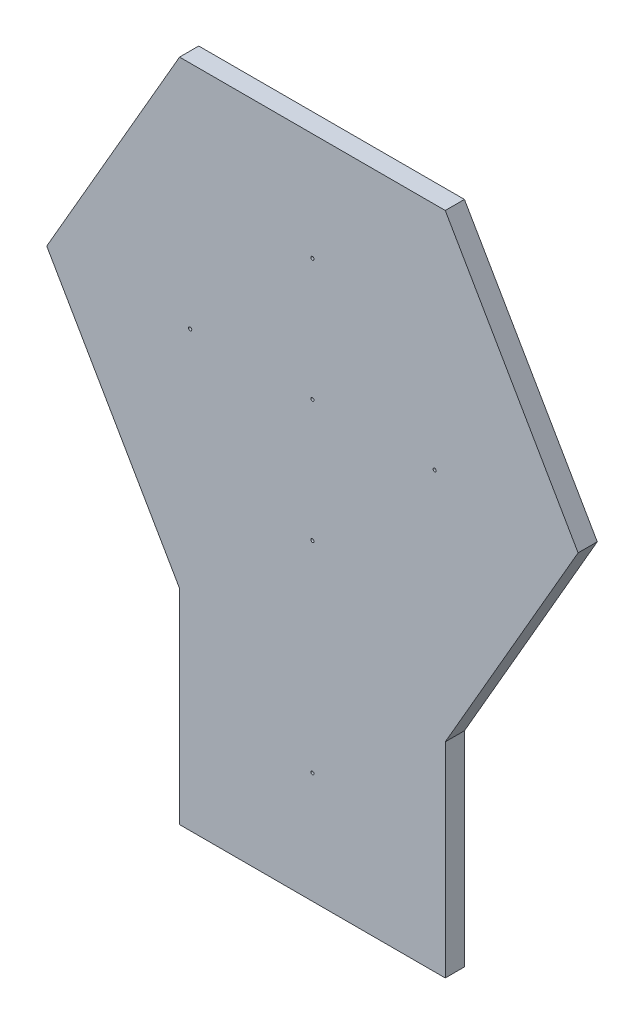
ISO-10303-21;
HEADER;
FILE_DESCRIPTION(('STEP AP214'),'2;1');
FILE_NAME('part.step','',(''),(''),'','','');
FILE_SCHEMA(('AUTOMOTIVE_DESIGN { 1 0 10303 214 1 1 1 1 }'));
ENDSEC;
DATA;
#1=APPLICATION_CONTEXT('core data for automotive mechanical design processes');
#2=APPLICATION_PROTOCOL_DEFINITION('international standard','automotive_design',2000,#1);
#3=PRODUCT_CONTEXT('',#1,'mechanical');
#4=PRODUCT('Part','Part','',(#3));
#5=PRODUCT_RELATED_PRODUCT_CATEGORY('part','',(#4));
#6=PRODUCT_DEFINITION_FORMATION('','',#4);
#7=PRODUCT_DEFINITION_CONTEXT('part definition',#1,'design');
#8=PRODUCT_DEFINITION('design','',#6,#7);
#9=PRODUCT_DEFINITION_SHAPE('','',#8);
#10=(LENGTH_UNIT() NAMED_UNIT(*) SI_UNIT(.MILLI.,.METRE.));
#11=(NAMED_UNIT(*) PLANE_ANGLE_UNIT() SI_UNIT($,.RADIAN.));
#12=(NAMED_UNIT(*) SI_UNIT($,.STERADIAN.) SOLID_ANGLE_UNIT());
#13=UNCERTAINTY_MEASURE_WITH_UNIT(LENGTH_MEASURE(1.E-05),#10,'distance_accuracy_value','');
#14=(GEOMETRIC_REPRESENTATION_CONTEXT(3) GLOBAL_UNCERTAINTY_ASSIGNED_CONTEXT((#13)) GLOBAL_UNIT_ASSIGNED_CONTEXT((#10,
#11,#12)) REPRESENTATION_CONTEXT('',''));
#15=CARTESIAN_POINT('',(0.,0.,0.));
#16=DIRECTION('',(0.,0.,1.));
#17=DIRECTION('',(1.,0.,0.));
#18=AXIS2_PLACEMENT_3D('',#15,#16,#17);
#19=CARTESIAN_POINT('',(-197.973407305123,114.3,19.05));
#20=DIRECTION('',(-0.866025403784439,0.499999999999999,0.));
#21=DIRECTION('',(-0.499999999999999,-0.866025403784439,0.));
#22=AXIS2_PLACEMENT_3D('',#19,#20,#21);
#23=PLANE('',#22);
#24=DIRECTION('',(0.499999999999999,0.866025403784439,0.));
#25=VECTOR('',#24,1.);
#26=CARTESIAN_POINT('',(-197.973407305123,114.3,0.));
#27=LINE('',#26,#25);
#28=CARTESIAN_POINT('',(-263.964543073497,-7.35522753814166E-13,0.));
#29=VERTEX_POINT('',#28);
#30=CARTESIAN_POINT('',(-131.982271536748,228.6,0.));
#31=VERTEX_POINT('',#30);
#32=EDGE_CURVE('E118',#29,#31,#27,.T.);
#33=ORIENTED_EDGE('',*,*,#32,.F.);
#34=DIRECTION('',(0.,0.,-1.));
#35=VECTOR('',#34,1.);
#36=CARTESIAN_POINT('',(-263.964543073497,-7.35522753814166E-13,19.05));
#37=LINE('',#36,#35);
#38=CARTESIAN_POINT('',(-263.964543073497,-7.35522753814166E-13,19.05));
#39=VERTEX_POINT('',#38);
#40=EDGE_CURVE('E11',#39,#29,#37,.T.);
#41=ORIENTED_EDGE('',*,*,#40,.F.);
#42=DIRECTION('',(0.499999999999999,0.866025403784439,0.));
#43=VECTOR('',#42,1.);
#44=CARTESIAN_POINT('',(-197.973407305123,114.3,19.05));
#45=LINE('',#44,#43);
#46=CARTESIAN_POINT('',(-131.982271536748,228.6,19.05));
#47=VERTEX_POINT('',#46);
#48=EDGE_CURVE('E130',#39,#47,#45,.T.);
#49=ORIENTED_EDGE('',*,*,#48,.T.);
#50=DIRECTION('',(0.,0.,-1.));
#51=VECTOR('',#50,1.);
#52=CARTESIAN_POINT('',(-131.982271536748,228.6,19.05));
#53=LINE('',#52,#51);
#54=EDGE_CURVE('E51',#47,#31,#53,.T.);
#55=ORIENTED_EDGE('',*,*,#54,.T.);
#56=EDGE_LOOP('',(#33,#41,#49,#55));
#57=FACE_BOUND('',#56,.T.);
#58=ADVANCED_FACE('F35',(#57),#23,.T.);
#59=CARTESIAN_POINT('',(-197.973407305123,-114.3,19.05));
#60=DIRECTION('',(-0.866025403784438,-0.5,0.));
#61=DIRECTION('',(0.5,-0.866025403784438,0.));
#62=AXIS2_PLACEMENT_3D('',#59,#60,#61);
#63=PLANE('',#62);
#64=DIRECTION('',(-0.5,0.866025403784438,0.));
#65=VECTOR('',#64,1.);
#66=CARTESIAN_POINT('',(-197.973407305123,-114.3,0.));
#67=LINE('',#66,#65);
#68=CARTESIAN_POINT('',(-131.982271536748,-228.6,0.));
#69=VERTEX_POINT('',#68);
#70=EDGE_CURVE('E120',#69,#29,#67,.T.);
#71=ORIENTED_EDGE('',*,*,#70,.F.);
#72=DIRECTION('',(0.,0.,-1.));
#73=VECTOR('',#72,1.);
#74=CARTESIAN_POINT('',(-131.982271536748,-228.6,19.05));
#75=LINE('',#74,#73);
#76=CARTESIAN_POINT('',(-131.982271536748,-228.6,19.05));
#77=VERTEX_POINT('',#76);
#78=EDGE_CURVE('E43',#77,#69,#75,.T.);
#79=ORIENTED_EDGE('',*,*,#78,.F.);
#80=DIRECTION('',(-0.5,0.866025403784438,0.));
#81=VECTOR('',#80,1.);
#82=CARTESIAN_POINT('',(-197.973407305123,-114.3,19.05));
#83=LINE('',#82,#81);
#84=EDGE_CURVE('E110',#77,#39,#83,.T.);
#85=ORIENTED_EDGE('',*,*,#84,.T.);
#86=ORIENTED_EDGE('',*,*,#40,.T.);
#87=EDGE_LOOP('',(#71,#79,#85,#86));
#88=FACE_BOUND('',#87,.T.);
#89=ADVANCED_FACE('F174',(#88),#63,.T.);
#90=CARTESIAN_POINT('',(197.973407305123,-114.3,19.05));
#91=DIRECTION('',(0.866025403784439,-0.5,0.));
#92=DIRECTION('',(0.5,0.866025403784439,0.));
#93=AXIS2_PLACEMENT_3D('',#90,#91,#92);
#94=PLANE('',#93);
#95=DIRECTION('',(-0.5,-0.866025403784439,0.));
#96=VECTOR('',#95,1.);
#97=CARTESIAN_POINT('',(197.973407305123,-114.3,0.));
#98=LINE('',#97,#96);
#99=CARTESIAN_POINT('',(263.964543073497,6.10622663543836E-13,0.));
#100=VERTEX_POINT('',#99);
#101=CARTESIAN_POINT('',(131.982271536749,-228.599999999999,0.));
#102=VERTEX_POINT('',#101);
#103=EDGE_CURVE('E95',#100,#102,#98,.T.);
#104=ORIENTED_EDGE('',*,*,#103,.F.);
#105=DIRECTION('',(0.,0.,-1.));
#106=VECTOR('',#105,1.);
#107=CARTESIAN_POINT('',(263.964543073497,6.10622663543836E-13,19.05));
#108=LINE('',#107,#106);
#109=CARTESIAN_POINT('',(263.964543073497,6.10622663543836E-13,19.05));
#110=VERTEX_POINT('',#109);
#111=EDGE_CURVE('E89',#110,#100,#108,.T.);
#112=ORIENTED_EDGE('',*,*,#111,.F.);
#113=DIRECTION('',(-0.5,-0.866025403784439,0.));
#114=VECTOR('',#113,1.);
#115=CARTESIAN_POINT('',(197.973407305123,-114.3,19.05));
#116=LINE('',#115,#114);
#117=CARTESIAN_POINT('',(131.982271536749,-228.599999999999,19.05));
#118=VERTEX_POINT('',#117);
#119=EDGE_CURVE('E92',#110,#118,#116,.T.);
#120=ORIENTED_EDGE('',*,*,#119,.T.);
#121=DIRECTION('',(0.,0.,-1.));
#122=VECTOR('',#121,1.);
#123=CARTESIAN_POINT('',(131.982271536749,-228.599999999999,19.05));
#124=LINE('',#123,#122);
#125=EDGE_CURVE('E99',#118,#102,#124,.T.);
#126=ORIENTED_EDGE('',*,*,#125,.T.);
#127=EDGE_LOOP('',(#104,#112,#120,#126));
#128=FACE_BOUND('',#127,.T.);
#129=ADVANCED_FACE('F91',(#128),#94,.T.);
#130=CARTESIAN_POINT('',(197.973407305123,114.3,19.05));
#131=DIRECTION('',(0.866025403784439,0.5,0.));
#132=DIRECTION('',(-0.5,0.866025403784438,0.));
#133=AXIS2_PLACEMENT_3D('',#130,#131,#132);
#134=PLANE('',#133);
#135=DIRECTION('',(0.5,-0.866025403784439,0.));
#136=VECTOR('',#135,1.);
#137=CARTESIAN_POINT('',(197.973407305123,114.3,0.));
#138=LINE('',#137,#136);
#139=CARTESIAN_POINT('',(131.982271536748,228.6,0.));
#140=VERTEX_POINT('',#139);
#141=EDGE_CURVE('E125',#140,#100,#138,.T.);
#142=ORIENTED_EDGE('',*,*,#141,.F.);
#143=DIRECTION('',(0.,0.,-1.));
#144=VECTOR('',#143,1.);
#145=CARTESIAN_POINT('',(131.982271536748,228.6,19.05));
#146=LINE('',#145,#144);
#147=CARTESIAN_POINT('',(131.982271536748,228.6,19.05));
#148=VERTEX_POINT('',#147);
#149=EDGE_CURVE('E68',#148,#140,#146,.T.);
#150=ORIENTED_EDGE('',*,*,#149,.F.);
#151=DIRECTION('',(0.5,-0.866025403784439,0.));
#152=VECTOR('',#151,1.);
#153=CARTESIAN_POINT('',(197.973407305123,114.3,19.05));
#154=LINE('',#153,#152);
#155=EDGE_CURVE('E106',#148,#110,#154,.T.);
#156=ORIENTED_EDGE('',*,*,#155,.T.);
#157=ORIENTED_EDGE('',*,*,#111,.T.);
#158=EDGE_LOOP('',(#142,#150,#156,#157));
#159=FACE_BOUND('',#158,.T.);
#160=ADVANCED_FACE('F112',(#159),#134,.T.);
#161=CARTESIAN_POINT('',(0.,228.6,19.05));
#162=DIRECTION('',(0.,1.,0.));
#163=DIRECTION('',(-1.,0.,0.));
#164=AXIS2_PLACEMENT_3D('',#161,#162,#163);
#165=PLANE('',#164);
#166=DIRECTION('',(1.,0.,0.));
#167=VECTOR('',#166,1.);
#168=CARTESIAN_POINT('',(0.,228.6,0.));
#169=LINE('',#168,#167);
#170=EDGE_CURVE('E127',#31,#140,#169,.T.);
#171=ORIENTED_EDGE('',*,*,#170,.F.);
#172=ORIENTED_EDGE('',*,*,#54,.F.);
#173=DIRECTION('',(1.,0.,0.));
#174=VECTOR('',#173,1.);
#175=CARTESIAN_POINT('',(0.,228.6,19.05));
#176=LINE('',#175,#174);
#177=EDGE_CURVE('E113',#47,#148,#176,.T.);
#178=ORIENTED_EDGE('',*,*,#177,.T.);
#179=ORIENTED_EDGE('',*,*,#149,.T.);
#180=EDGE_LOOP('',(#171,#172,#178,#179));
#181=FACE_BOUND('',#180,.T.);
#182=ADVANCED_FACE('F187',(#181),#165,.T.);
#183=CARTESIAN_POINT('',(0.,0.,19.05));
#184=DIRECTION('',(0.,0.,1.));
#185=DIRECTION('',(1.,0.,0.));
#186=AXIS2_PLACEMENT_3D('',#183,#184,#185);
#187=PLANE('',#186);
#188=CARTESIAN_POINT('',(-1.27205576053239E-12,-121.44375,19.05));
#189=DIRECTION('',(0.,0.,1.));
#190=DIRECTION('',(1.,0.,0.));
#191=AXIS2_PLACEMENT_3D('',#188,#189,#190);
#192=CIRCLE('',#191,1.58749999999999);
#193=CARTESIAN_POINT('',(1.58749999999872,-121.44375,19.05));
#194=VERTEX_POINT('',#193);
#195=EDGE_CURVE('E237',#194,#194,#192,.T.);
#196=ORIENTED_EDGE('',*,*,#195,.F.);
#197=EDGE_LOOP('',(#196));
#198=FACE_BOUND('',#197,.T.);
#199=CARTESIAN_POINT('',(121.44375,-8.48037173688262E-13,19.05));
#200=DIRECTION('',(0.,0.,1.));
#201=DIRECTION('',(1.,0.,0.));
#202=AXIS2_PLACEMENT_3D('',#199,#200,#201);
#203=CIRCLE('',#202,1.5875);
#204=CARTESIAN_POINT('',(123.03125,-8.48037173688262E-13,19.05));
#205=VERTEX_POINT('',#204);
#206=EDGE_CURVE('E239',#205,#205,#203,.T.);
#207=ORIENTED_EDGE('',*,*,#206,.F.);
#208=EDGE_LOOP('',(#207));
#209=FACE_BOUND('',#208,.T.);
#210=CARTESIAN_POINT('',(4.24018586844131E-13,121.44375,19.05));
#211=DIRECTION('',(0.,0.,1.));
#212=DIRECTION('',(1.,0.,0.));
#213=AXIS2_PLACEMENT_3D('',#210,#211,#212);
#214=CIRCLE('',#213,1.5875);
#215=CARTESIAN_POINT('',(1.58750000000042,121.44375,19.05));
#216=VERTEX_POINT('',#215);
#217=EDGE_CURVE('E245',#216,#216,#214,.T.);
#218=ORIENTED_EDGE('',*,*,#217,.F.);
#219=EDGE_LOOP('',(#218));
#220=FACE_BOUND('',#219,.T.);
#221=CARTESIAN_POINT('',(-121.44375,0.,19.05));
#222=DIRECTION('',(0.,0.,1.));
#223=DIRECTION('',(1.,0.,0.));
#224=AXIS2_PLACEMENT_3D('',#221,#222,#223);
#225=CIRCLE('',#224,1.5875);
#226=CARTESIAN_POINT('',(-119.85625,0.,19.05));
#227=VERTEX_POINT('',#226);
#228=EDGE_CURVE('E251',#227,#227,#225,.T.);
#229=ORIENTED_EDGE('',*,*,#228,.F.);
#230=EDGE_LOOP('',(#229));
#231=FACE_BOUND('',#230,.T.);
#232=CARTESIAN_POINT('',(0.,-321.31,19.05));
#233=DIRECTION('',(0.,0.,1.));
#234=DIRECTION('',(1.,0.,0.));
#235=AXIS2_PLACEMENT_3D('',#232,#233,#234);
#236=CIRCLE('',#235,1.5875);
#237=CARTESIAN_POINT('',(1.5875,-321.31,19.05));
#238=VERTEX_POINT('',#237);
#239=EDGE_CURVE('E257',#238,#238,#236,.T.);
#240=ORIENTED_EDGE('',*,*,#239,.F.);
#241=EDGE_LOOP('',(#240));
#242=FACE_BOUND('',#241,.T.);
#243=CARTESIAN_POINT('',(0.,0.,19.05));
#244=DIRECTION('',(0.,0.,1.));
#245=DIRECTION('',(1.,0.,0.));
#246=AXIS2_PLACEMENT_3D('',#243,#244,#245);
#247=CIRCLE('',#246,1.5875);
#248=CARTESIAN_POINT('',(1.5875,0.,19.05));
#249=VERTEX_POINT('',#248);
#250=EDGE_CURVE('E162',#249,#249,#247,.T.);
#251=ORIENTED_EDGE('',*,*,#250,.F.);
#252=EDGE_LOOP('',(#251));
#253=FACE_BOUND('',#252,.T.);
#254=ORIENTED_EDGE('',*,*,#48,.F.);
#255=ORIENTED_EDGE('',*,*,#84,.F.);
#256=DIRECTION('',(0.,-1.,0.));
#257=VECTOR('',#256,1.);
#258=CARTESIAN_POINT('',(-131.982271536748,-228.6,19.05));
#259=LINE('',#258,#257);
#260=CARTESIAN_POINT('',(-131.982271536748,-431.799999999999,19.05));
#261=VERTEX_POINT('',#260);
#262=EDGE_CURVE('E143',#77,#261,#259,.T.);
#263=ORIENTED_EDGE('',*,*,#262,.T.);
#264=DIRECTION('',(1.,0.,0.));
#265=VECTOR('',#264,1.);
#266=CARTESIAN_POINT('',(-131.982271536748,-431.799999999999,19.05));
#267=LINE('',#266,#265);
#268=CARTESIAN_POINT('',(131.982271536749,-431.799999999999,19.05));
#269=VERTEX_POINT('',#268);
#270=EDGE_CURVE('E159',#261,#269,#267,.T.);
#271=ORIENTED_EDGE('',*,*,#270,.T.);
#272=DIRECTION('',(0.,1.,0.));
#273=VECTOR('',#272,1.);
#274=CARTESIAN_POINT('',(131.982271536749,-228.599999999999,19.05));
#275=LINE('',#274,#273);
#276=EDGE_CURVE('E109',#269,#118,#275,.T.);
#277=ORIENTED_EDGE('',*,*,#276,.T.);
#278=ORIENTED_EDGE('',*,*,#119,.F.);
#279=ORIENTED_EDGE('',*,*,#155,.F.);
#280=ORIENTED_EDGE('',*,*,#177,.F.);
#281=EDGE_LOOP('',(#254,#255,#263,#271,#277,#278,#279,#280));
#282=FACE_BOUND('',#281,.T.);
#283=ADVANCED_FACE('F104',(#198,#209,#220,#231,#242,#253,#282),#187,.T.);
#284=CARTESIAN_POINT('',(0.,0.,0.));
#285=DIRECTION('',(0.,0.,1.));
#286=DIRECTION('',(1.,0.,0.));
#287=AXIS2_PLACEMENT_3D('',#284,#285,#286);
#288=PLANE('',#287);
#289=CARTESIAN_POINT('',(-1.27205576053239E-12,-121.44375,0.));
#290=DIRECTION('',(0.,0.,1.));
#291=DIRECTION('',(1.,0.,0.));
#292=AXIS2_PLACEMENT_3D('',#289,#290,#291);
#293=CIRCLE('',#292,1.58749999999999);
#294=CARTESIAN_POINT('',(1.58749999999872,-121.44375,0.));
#295=VERTEX_POINT('',#294);
#296=EDGE_CURVE('E234',#295,#295,#293,.T.);
#297=ORIENTED_EDGE('',*,*,#296,.T.);
#298=EDGE_LOOP('',(#297));
#299=FACE_BOUND('',#298,.T.);
#300=CARTESIAN_POINT('',(121.44375,-8.48037173688262E-13,0.));
#301=DIRECTION('',(0.,0.,1.));
#302=DIRECTION('',(1.,0.,0.));
#303=AXIS2_PLACEMENT_3D('',#300,#301,#302);
#304=CIRCLE('',#303,1.5875);
#305=CARTESIAN_POINT('',(123.03125,-8.48037173688262E-13,0.));
#306=VERTEX_POINT('',#305);
#307=EDGE_CURVE('E242',#306,#306,#304,.T.);
#308=ORIENTED_EDGE('',*,*,#307,.T.);
#309=EDGE_LOOP('',(#308));
#310=FACE_BOUND('',#309,.T.);
#311=CARTESIAN_POINT('',(4.24018586844131E-13,121.44375,0.));
#312=DIRECTION('',(0.,0.,1.));
#313=DIRECTION('',(1.,0.,0.));
#314=AXIS2_PLACEMENT_3D('',#311,#312,#313);
#315=CIRCLE('',#314,1.5875);
#316=CARTESIAN_POINT('',(1.58750000000042,121.44375,0.));
#317=VERTEX_POINT('',#316);
#318=EDGE_CURVE('E248',#317,#317,#315,.T.);
#319=ORIENTED_EDGE('',*,*,#318,.T.);
#320=EDGE_LOOP('',(#319));
#321=FACE_BOUND('',#320,.T.);
#322=CARTESIAN_POINT('',(-121.44375,0.,0.));
#323=DIRECTION('',(0.,0.,1.));
#324=DIRECTION('',(1.,0.,0.));
#325=AXIS2_PLACEMENT_3D('',#322,#323,#324);
#326=CIRCLE('',#325,1.5875);
#327=CARTESIAN_POINT('',(-119.85625,0.,0.));
#328=VERTEX_POINT('',#327);
#329=EDGE_CURVE('E254',#328,#328,#326,.T.);
#330=ORIENTED_EDGE('',*,*,#329,.T.);
#331=EDGE_LOOP('',(#330));
#332=FACE_BOUND('',#331,.T.);
#333=CARTESIAN_POINT('',(0.,-321.31,0.));
#334=DIRECTION('',(0.,0.,1.));
#335=DIRECTION('',(1.,0.,0.));
#336=AXIS2_PLACEMENT_3D('',#333,#334,#335);
#337=CIRCLE('',#336,1.5875);
#338=CARTESIAN_POINT('',(1.5875,-321.31,0.));
#339=VERTEX_POINT('',#338);
#340=EDGE_CURVE('E260',#339,#339,#337,.T.);
#341=ORIENTED_EDGE('',*,*,#340,.T.);
#342=EDGE_LOOP('',(#341));
#343=FACE_BOUND('',#342,.T.);
#344=CARTESIAN_POINT('',(0.,0.,0.));
#345=DIRECTION('',(0.,0.,1.));
#346=DIRECTION('',(1.,0.,0.));
#347=AXIS2_PLACEMENT_3D('',#344,#345,#346);
#348=CIRCLE('',#347,1.5875);
#349=CARTESIAN_POINT('',(1.5875,0.,0.));
#350=VERTEX_POINT('',#349);
#351=EDGE_CURVE('E169',#350,#350,#348,.T.);
#352=ORIENTED_EDGE('',*,*,#351,.T.);
#353=EDGE_LOOP('',(#352));
#354=FACE_BOUND('',#353,.T.);
#355=ORIENTED_EDGE('',*,*,#32,.T.);
#356=ORIENTED_EDGE('',*,*,#170,.T.);
#357=ORIENTED_EDGE('',*,*,#141,.T.);
#358=ORIENTED_EDGE('',*,*,#103,.T.);
#359=DIRECTION('',(0.,1.,0.));
#360=VECTOR('',#359,1.);
#361=CARTESIAN_POINT('',(131.982271536749,-228.599999999999,0.));
#362=LINE('',#361,#360);
#363=CARTESIAN_POINT('',(131.982271536749,-431.799999999999,0.));
#364=VERTEX_POINT('',#363);
#365=EDGE_CURVE('E157',#364,#102,#362,.T.);
#366=ORIENTED_EDGE('',*,*,#365,.F.);
#367=DIRECTION('',(1.,0.,0.));
#368=VECTOR('',#367,1.);
#369=CARTESIAN_POINT('',(-131.982271536748,-431.799999999999,0.));
#370=LINE('',#369,#368);
#371=CARTESIAN_POINT('',(-131.982271536748,-431.799999999999,0.));
#372=VERTEX_POINT('',#371);
#373=EDGE_CURVE('E155',#372,#364,#370,.T.);
#374=ORIENTED_EDGE('',*,*,#373,.F.);
#375=DIRECTION('',(0.,-1.,0.));
#376=VECTOR('',#375,1.);
#377=CARTESIAN_POINT('',(-131.982271536748,-228.6,0.));
#378=LINE('',#377,#376);
#379=EDGE_CURVE('E141',#69,#372,#378,.T.);
#380=ORIENTED_EDGE('',*,*,#379,.F.);
#381=ORIENTED_EDGE('',*,*,#70,.T.);
#382=EDGE_LOOP('',(#355,#356,#357,#358,#366,#374,#380,#381));
#383=FACE_BOUND('',#382,.T.);
#384=ADVANCED_FACE('F152',(#299,#310,#321,#332,#343,#354,#383),#288,.F.);
#385=CARTESIAN_POINT('',(-131.982271536748,-228.6,0.));
#386=DIRECTION('',(-1.,0.,0.));
#387=DIRECTION('',(0.,-1.,0.));
#388=AXIS2_PLACEMENT_3D('',#385,#386,#387);
#389=PLANE('',#388);
#390=ORIENTED_EDGE('',*,*,#262,.F.);
#391=ORIENTED_EDGE('',*,*,#78,.T.);
#392=ORIENTED_EDGE('',*,*,#379,.T.);
#393=DIRECTION('',(0.,0.,1.));
#394=VECTOR('',#393,1.);
#395=CARTESIAN_POINT('',(-131.982271536748,-431.799999999999,0.));
#396=LINE('',#395,#394);
#397=EDGE_CURVE('E167',#372,#261,#396,.T.);
#398=ORIENTED_EDGE('',*,*,#397,.T.);
#399=EDGE_LOOP('',(#390,#391,#392,#398));
#400=FACE_BOUND('',#399,.T.);
#401=ADVANCED_FACE('F138',(#400),#389,.T.);
#402=CARTESIAN_POINT('',(131.982271536749,-228.599999999999,0.));
#403=DIRECTION('',(1.,0.,0.));
#404=DIRECTION('',(0.,1.,0.));
#405=AXIS2_PLACEMENT_3D('',#402,#403,#404);
#406=PLANE('',#405);
#407=ORIENTED_EDGE('',*,*,#276,.F.);
#408=DIRECTION('',(0.,0.,1.));
#409=VECTOR('',#408,1.);
#410=CARTESIAN_POINT('',(131.982271536749,-431.799999999999,0.));
#411=LINE('',#410,#409);
#412=EDGE_CURVE('E121',#364,#269,#411,.T.);
#413=ORIENTED_EDGE('',*,*,#412,.F.);
#414=ORIENTED_EDGE('',*,*,#365,.T.);
#415=ORIENTED_EDGE('',*,*,#125,.F.);
#416=EDGE_LOOP('',(#407,#413,#414,#415));
#417=FACE_BOUND('',#416,.T.);
#418=ADVANCED_FACE('F198',(#417),#406,.T.);
#419=CARTESIAN_POINT('',(-131.982271536748,-431.799999999999,0.));
#420=DIRECTION('',(0.,-1.,0.));
#421=DIRECTION('',(0.,0.,-1.));
#422=AXIS2_PLACEMENT_3D('',#419,#420,#421);
#423=PLANE('',#422);
#424=ORIENTED_EDGE('',*,*,#270,.F.);
#425=ORIENTED_EDGE('',*,*,#397,.F.);
#426=ORIENTED_EDGE('',*,*,#373,.T.);
#427=ORIENTED_EDGE('',*,*,#412,.T.);
#428=EDGE_LOOP('',(#424,#425,#426,#427));
#429=FACE_BOUND('',#428,.T.);
#430=ADVANCED_FACE('F199',(#429),#423,.T.);
#431=CARTESIAN_POINT('',(0.,0.,0.));
#432=DIRECTION('',(0.,0.,1.));
#433=DIRECTION('',(1.,0.,0.));
#434=AXIS2_PLACEMENT_3D('',#431,#432,#433);
#435=CYLINDRICAL_SURFACE('',#434,1.5875);
#436=CARTESIAN_POINT('',(1.5875,0.,0.));
#437=CARTESIAN_POINT('',(1.5875,0.,0.1984375));
#438=CARTESIAN_POINT('',(1.5875,0.,0.396875));
#439=CARTESIAN_POINT('',(1.5875,0.,0.79375));
#440=CARTESIAN_POINT('',(1.5875,0.,0.9921875));
#441=CARTESIAN_POINT('',(1.5875,0.,1.3890625));
#442=CARTESIAN_POINT('',(1.5875,0.,1.5875));
#443=CARTESIAN_POINT('',(1.5875,0.,1.984375));
#444=CARTESIAN_POINT('',(1.5875,0.,2.1828125));
#445=CARTESIAN_POINT('',(1.5875,0.,2.5796875));
#446=CARTESIAN_POINT('',(1.5875,0.,2.778125));
#447=CARTESIAN_POINT('',(1.5875,0.,3.175));
#448=CARTESIAN_POINT('',(1.5875,0.,3.3734375));
#449=CARTESIAN_POINT('',(1.5875,0.,3.7703125));
#450=CARTESIAN_POINT('',(1.5875,0.,3.96875));
#451=CARTESIAN_POINT('',(1.5875,0.,4.365625));
#452=CARTESIAN_POINT('',(1.5875,0.,4.5640625));
#453=CARTESIAN_POINT('',(1.5875,0.,4.9609375));
#454=CARTESIAN_POINT('',(1.5875,0.,5.159375));
#455=CARTESIAN_POINT('',(1.5875,0.,5.55625));
#456=CARTESIAN_POINT('',(1.5875,0.,5.7546875));
#457=CARTESIAN_POINT('',(1.5875,0.,6.1515625));
#458=CARTESIAN_POINT('',(1.5875,0.,6.35));
#459=CARTESIAN_POINT('',(1.5875,0.,6.746875));
#460=CARTESIAN_POINT('',(1.5875,0.,6.9453125));
#461=CARTESIAN_POINT('',(1.5875,0.,7.3421875));
#462=CARTESIAN_POINT('',(1.5875,0.,7.540625));
#463=CARTESIAN_POINT('',(1.5875,0.,7.9375));
#464=CARTESIAN_POINT('',(1.5875,0.,8.1359375));
#465=CARTESIAN_POINT('',(1.5875,0.,8.5328125));
#466=CARTESIAN_POINT('',(1.5875,0.,8.73125));
#467=CARTESIAN_POINT('',(1.5875,0.,9.128125));
#468=CARTESIAN_POINT('',(1.5875,0.,9.3265625));
#469=CARTESIAN_POINT('',(1.5875,0.,9.7234375));
#470=CARTESIAN_POINT('',(1.5875,0.,9.921875));
#471=CARTESIAN_POINT('',(1.5875,0.,10.31875));
#472=CARTESIAN_POINT('',(1.5875,0.,10.5171875));
#473=CARTESIAN_POINT('',(1.5875,0.,10.9140625));
#474=CARTESIAN_POINT('',(1.5875,0.,11.1125));
#475=CARTESIAN_POINT('',(1.5875,0.,11.509375));
#476=CARTESIAN_POINT('',(1.5875,0.,11.7078125));
#477=CARTESIAN_POINT('',(1.5875,0.,12.1046875));
#478=CARTESIAN_POINT('',(1.5875,0.,12.303125));
#479=CARTESIAN_POINT('',(1.5875,0.,12.7));
#480=CARTESIAN_POINT('',(1.5875,0.,12.8984375));
#481=CARTESIAN_POINT('',(1.5875,0.,13.2953125));
#482=CARTESIAN_POINT('',(1.5875,0.,13.49375));
#483=CARTESIAN_POINT('',(1.5875,0.,13.890625));
#484=CARTESIAN_POINT('',(1.5875,0.,14.0890625));
#485=CARTESIAN_POINT('',(1.5875,0.,14.4859375));
#486=CARTESIAN_POINT('',(1.5875,0.,14.684375));
#487=CARTESIAN_POINT('',(1.5875,0.,15.08125));
#488=CARTESIAN_POINT('',(1.5875,0.,15.2796875));
#489=CARTESIAN_POINT('',(1.5875,0.,15.6765625));
#490=CARTESIAN_POINT('',(1.5875,0.,15.875));
#491=CARTESIAN_POINT('',(1.5875,0.,16.271875));
#492=CARTESIAN_POINT('',(1.5875,0.,16.4703125));
#493=CARTESIAN_POINT('',(1.5875,0.,16.8671875));
#494=CARTESIAN_POINT('',(1.5875,0.,17.065625));
#495=CARTESIAN_POINT('',(1.5875,0.,17.4625));
#496=CARTESIAN_POINT('',(1.5875,0.,17.6609375));
#497=CARTESIAN_POINT('',(1.5875,0.,18.0578125));
#498=CARTESIAN_POINT('',(1.5875,0.,18.25625));
#499=CARTESIAN_POINT('',(1.5875,0.,18.653125));
#500=CARTESIAN_POINT('',(1.5875,0.,18.8515625));
#501=CARTESIAN_POINT('',(1.5875,0.,19.05));
#502=B_SPLINE_CURVE_WITH_KNOTS('',3,(#436,#437,#438,#439,#440,#441,#442,#443,#444,#445,#446,
#447,#448,#449,#450,#451,#452,#453,#454,#455,#456,#457,#458,#459,#460,#461,#462,#463,#464,#465,
#466,#467,#468,#469,#470,#471,#472,#473,#474,#475,#476,#477,#478,#479,#480,#481,#482,#483,#484,
#485,#486,#487,#488,#489,#490,#491,#492,#493,#494,#495,#496,#497,#498,#499,#500,#501),
.UNSPECIFIED.,.F.,.F.,(4,2,2,2,2,2,2,2,2,2,2,2,2,2,2,2,2,2,2,2,2,2,2,2,2,2,2,2,2,2,2,2,4),(0.,
0.5953125,1.190625,1.7859375,2.38125,2.9765625,3.571875,4.1671875,4.7625,5.3578125,5.953125,
6.5484375,7.14375,7.7390625,8.334375,8.9296875,9.525,10.1203125,10.715625,11.3109375,11.90625,
12.5015625,13.096875,13.6921875,14.2875,14.8828125,15.478125,16.0734375,16.66875,17.2640625,
17.859375,18.4546875,19.05),.UNSPECIFIED.);
#503=EDGE_CURVE('BSEAM202',#350,#249,#502,.T.);
#504=ORIENTED_EDGE('',*,*,#351,.F.);
#505=ORIENTED_EDGE('',*,*,#250,.T.);
#506=ORIENTED_EDGE('',*,*,#503,.T.);
#507=ORIENTED_EDGE('',*,*,#503,.F.);
#508=EDGE_LOOP('',(#504,#506,#505,#507));
#509=FACE_BOUND('',#508,.T.);
#510=ADVANCED_FACE('F202',(#509),#435,.F.);
#511=CARTESIAN_POINT('',(0.,-321.31,0.));
#512=DIRECTION('',(0.,0.,1.));
#513=DIRECTION('',(1.,0.,0.));
#514=AXIS2_PLACEMENT_3D('',#511,#512,#513);
#515=CYLINDRICAL_SURFACE('',#514,1.5875);
#516=CARTESIAN_POINT('',(1.5875,-321.31,0.));
#517=CARTESIAN_POINT('',(1.5875,-321.31,0.1984375));
#518=CARTESIAN_POINT('',(1.5875,-321.31,0.396875));
#519=CARTESIAN_POINT('',(1.5875,-321.31,0.79375));
#520=CARTESIAN_POINT('',(1.5875,-321.31,0.9921875));
#521=CARTESIAN_POINT('',(1.5875,-321.31,1.3890625));
#522=CARTESIAN_POINT('',(1.5875,-321.31,1.5875));
#523=CARTESIAN_POINT('',(1.5875,-321.31,1.984375));
#524=CARTESIAN_POINT('',(1.5875,-321.31,2.1828125));
#525=CARTESIAN_POINT('',(1.5875,-321.31,2.5796875));
#526=CARTESIAN_POINT('',(1.5875,-321.31,2.778125));
#527=CARTESIAN_POINT('',(1.5875,-321.31,3.175));
#528=CARTESIAN_POINT('',(1.5875,-321.31,3.3734375));
#529=CARTESIAN_POINT('',(1.5875,-321.31,3.7703125));
#530=CARTESIAN_POINT('',(1.5875,-321.31,3.96875));
#531=CARTESIAN_POINT('',(1.5875,-321.31,4.365625));
#532=CARTESIAN_POINT('',(1.5875,-321.31,4.5640625));
#533=CARTESIAN_POINT('',(1.5875,-321.31,4.9609375));
#534=CARTESIAN_POINT('',(1.5875,-321.31,5.159375));
#535=CARTESIAN_POINT('',(1.5875,-321.31,5.55625));
#536=CARTESIAN_POINT('',(1.5875,-321.31,5.7546875));
#537=CARTESIAN_POINT('',(1.5875,-321.31,6.1515625));
#538=CARTESIAN_POINT('',(1.5875,-321.31,6.35));
#539=CARTESIAN_POINT('',(1.5875,-321.31,6.746875));
#540=CARTESIAN_POINT('',(1.5875,-321.31,6.9453125));
#541=CARTESIAN_POINT('',(1.5875,-321.31,7.3421875));
#542=CARTESIAN_POINT('',(1.5875,-321.31,7.540625));
#543=CARTESIAN_POINT('',(1.5875,-321.31,7.9375));
#544=CARTESIAN_POINT('',(1.5875,-321.31,8.1359375));
#545=CARTESIAN_POINT('',(1.5875,-321.31,8.5328125));
#546=CARTESIAN_POINT('',(1.5875,-321.31,8.73125));
#547=CARTESIAN_POINT('',(1.5875,-321.31,9.128125));
#548=CARTESIAN_POINT('',(1.5875,-321.31,9.3265625));
#549=CARTESIAN_POINT('',(1.5875,-321.31,9.7234375));
#550=CARTESIAN_POINT('',(1.5875,-321.31,9.921875));
#551=CARTESIAN_POINT('',(1.5875,-321.31,10.31875));
#552=CARTESIAN_POINT('',(1.5875,-321.31,10.5171875));
#553=CARTESIAN_POINT('',(1.5875,-321.31,10.9140625));
#554=CARTESIAN_POINT('',(1.5875,-321.31,11.1125));
#555=CARTESIAN_POINT('',(1.5875,-321.31,11.509375));
#556=CARTESIAN_POINT('',(1.5875,-321.31,11.7078125));
#557=CARTESIAN_POINT('',(1.5875,-321.31,12.1046875));
#558=CARTESIAN_POINT('',(1.5875,-321.31,12.303125));
#559=CARTESIAN_POINT('',(1.5875,-321.31,12.7));
#560=CARTESIAN_POINT('',(1.5875,-321.31,12.8984375));
#561=CARTESIAN_POINT('',(1.5875,-321.31,13.2953125));
#562=CARTESIAN_POINT('',(1.5875,-321.31,13.49375));
#563=CARTESIAN_POINT('',(1.5875,-321.31,13.890625));
#564=CARTESIAN_POINT('',(1.5875,-321.31,14.0890625));
#565=CARTESIAN_POINT('',(1.5875,-321.31,14.4859375));
#566=CARTESIAN_POINT('',(1.5875,-321.31,14.684375));
#567=CARTESIAN_POINT('',(1.5875,-321.31,15.08125));
#568=CARTESIAN_POINT('',(1.5875,-321.31,15.2796875));
#569=CARTESIAN_POINT('',(1.5875,-321.31,15.6765625));
#570=CARTESIAN_POINT('',(1.5875,-321.31,15.875));
#571=CARTESIAN_POINT('',(1.5875,-321.31,16.271875));
#572=CARTESIAN_POINT('',(1.5875,-321.31,16.4703125));
#573=CARTESIAN_POINT('',(1.5875,-321.31,16.8671875));
#574=CARTESIAN_POINT('',(1.5875,-321.31,17.065625));
#575=CARTESIAN_POINT('',(1.5875,-321.31,17.4625));
#576=CARTESIAN_POINT('',(1.5875,-321.31,17.6609375));
#577=CARTESIAN_POINT('',(1.5875,-321.31,18.0578125));
#578=CARTESIAN_POINT('',(1.5875,-321.31,18.25625));
#579=CARTESIAN_POINT('',(1.5875,-321.31,18.653125));
#580=CARTESIAN_POINT('',(1.5875,-321.31,18.8515625));
#581=CARTESIAN_POINT('',(1.5875,-321.31,19.05));
#582=B_SPLINE_CURVE_WITH_KNOTS('',3,(#516,#517,#518,#519,#520,#521,#522,#523,#524,#525,#526,
#527,#528,#529,#530,#531,#532,#533,#534,#535,#536,#537,#538,#539,#540,#541,#542,#543,#544,#545,
#546,#547,#548,#549,#550,#551,#552,#553,#554,#555,#556,#557,#558,#559,#560,#561,#562,#563,#564,
#565,#566,#567,#568,#569,#570,#571,#572,#573,#574,#575,#576,#577,#578,#579,#580,#581),
.UNSPECIFIED.,.F.,.F.,(4,2,2,2,2,2,2,2,2,2,2,2,2,2,2,2,2,2,2,2,2,2,2,2,2,2,2,2,2,2,2,2,4),(0.,
0.5953125,1.190625,1.7859375,2.38125,2.9765625,3.571875,4.1671875,4.7625,5.3578125,5.953125,
6.5484375,7.14375,7.7390625,8.334375,8.9296875,9.525,10.1203125,10.715625,11.3109375,11.90625,
12.5015625,13.096875,13.6921875,14.2875,14.8828125,15.478125,16.0734375,16.66875,17.2640625,
17.859375,18.4546875,19.05),.UNSPECIFIED.);
#583=EDGE_CURVE('BSEAM209',#339,#238,#582,.T.);
#584=ORIENTED_EDGE('',*,*,#340,.F.);
#585=ORIENTED_EDGE('',*,*,#239,.T.);
#586=ORIENTED_EDGE('',*,*,#583,.T.);
#587=ORIENTED_EDGE('',*,*,#583,.F.);
#588=EDGE_LOOP('',(#584,#586,#585,#587));
#589=FACE_BOUND('',#588,.T.);
#590=ADVANCED_FACE('F209',(#589),#515,.F.);
#591=CARTESIAN_POINT('',(-121.44375,0.,0.));
#592=DIRECTION('',(0.,0.,1.));
#593=DIRECTION('',(1.,0.,0.));
#594=AXIS2_PLACEMENT_3D('',#591,#592,#593);
#595=CYLINDRICAL_SURFACE('',#594,1.5875);
#596=CARTESIAN_POINT('',(-119.85625,0.,0.));
#597=CARTESIAN_POINT('',(-119.85625,0.,0.1984375));
#598=CARTESIAN_POINT('',(-119.85625,0.,0.396875));
#599=CARTESIAN_POINT('',(-119.85625,0.,0.79375));
#600=CARTESIAN_POINT('',(-119.85625,0.,0.9921875));
#601=CARTESIAN_POINT('',(-119.85625,0.,1.3890625));
#602=CARTESIAN_POINT('',(-119.85625,0.,1.5875));
#603=CARTESIAN_POINT('',(-119.85625,0.,1.984375));
#604=CARTESIAN_POINT('',(-119.85625,0.,2.1828125));
#605=CARTESIAN_POINT('',(-119.85625,0.,2.5796875));
#606=CARTESIAN_POINT('',(-119.85625,0.,2.778125));
#607=CARTESIAN_POINT('',(-119.85625,0.,3.175));
#608=CARTESIAN_POINT('',(-119.85625,0.,3.3734375));
#609=CARTESIAN_POINT('',(-119.85625,0.,3.7703125));
#610=CARTESIAN_POINT('',(-119.85625,0.,3.96875));
#611=CARTESIAN_POINT('',(-119.85625,0.,4.365625));
#612=CARTESIAN_POINT('',(-119.85625,0.,4.5640625));
#613=CARTESIAN_POINT('',(-119.85625,0.,4.9609375));
#614=CARTESIAN_POINT('',(-119.85625,0.,5.159375));
#615=CARTESIAN_POINT('',(-119.85625,0.,5.55625));
#616=CARTESIAN_POINT('',(-119.85625,0.,5.7546875));
#617=CARTESIAN_POINT('',(-119.85625,0.,6.1515625));
#618=CARTESIAN_POINT('',(-119.85625,0.,6.35));
#619=CARTESIAN_POINT('',(-119.85625,0.,6.746875));
#620=CARTESIAN_POINT('',(-119.85625,0.,6.9453125));
#621=CARTESIAN_POINT('',(-119.85625,0.,7.3421875));
#622=CARTESIAN_POINT('',(-119.85625,0.,7.540625));
#623=CARTESIAN_POINT('',(-119.85625,0.,7.9375));
#624=CARTESIAN_POINT('',(-119.85625,0.,8.1359375));
#625=CARTESIAN_POINT('',(-119.85625,0.,8.5328125));
#626=CARTESIAN_POINT('',(-119.85625,0.,8.73125));
#627=CARTESIAN_POINT('',(-119.85625,0.,9.128125));
#628=CARTESIAN_POINT('',(-119.85625,0.,9.3265625));
#629=CARTESIAN_POINT('',(-119.85625,0.,9.7234375));
#630=CARTESIAN_POINT('',(-119.85625,0.,9.921875));
#631=CARTESIAN_POINT('',(-119.85625,0.,10.31875));
#632=CARTESIAN_POINT('',(-119.85625,0.,10.5171875));
#633=CARTESIAN_POINT('',(-119.85625,0.,10.9140625));
#634=CARTESIAN_POINT('',(-119.85625,0.,11.1125));
#635=CARTESIAN_POINT('',(-119.85625,0.,11.509375));
#636=CARTESIAN_POINT('',(-119.85625,0.,11.7078125));
#637=CARTESIAN_POINT('',(-119.85625,0.,12.1046875));
#638=CARTESIAN_POINT('',(-119.85625,0.,12.303125));
#639=CARTESIAN_POINT('',(-119.85625,0.,12.7));
#640=CARTESIAN_POINT('',(-119.85625,0.,12.8984375));
#641=CARTESIAN_POINT('',(-119.85625,0.,13.2953125));
#642=CARTESIAN_POINT('',(-119.85625,0.,13.49375));
#643=CARTESIAN_POINT('',(-119.85625,0.,13.890625));
#644=CARTESIAN_POINT('',(-119.85625,0.,14.0890625));
#645=CARTESIAN_POINT('',(-119.85625,0.,14.4859375));
#646=CARTESIAN_POINT('',(-119.85625,0.,14.684375));
#647=CARTESIAN_POINT('',(-119.85625,0.,15.08125));
#648=CARTESIAN_POINT('',(-119.85625,0.,15.2796875));
#649=CARTESIAN_POINT('',(-119.85625,0.,15.6765625));
#650=CARTESIAN_POINT('',(-119.85625,0.,15.875));
#651=CARTESIAN_POINT('',(-119.85625,0.,16.271875));
#652=CARTESIAN_POINT('',(-119.85625,0.,16.4703125));
#653=CARTESIAN_POINT('',(-119.85625,0.,16.8671875));
#654=CARTESIAN_POINT('',(-119.85625,0.,17.065625));
#655=CARTESIAN_POINT('',(-119.85625,0.,17.4625));
#656=CARTESIAN_POINT('',(-119.85625,0.,17.6609375));
#657=CARTESIAN_POINT('',(-119.85625,0.,18.0578125));
#658=CARTESIAN_POINT('',(-119.85625,0.,18.25625));
#659=CARTESIAN_POINT('',(-119.85625,0.,18.653125));
#660=CARTESIAN_POINT('',(-119.85625,0.,18.8515625));
#661=CARTESIAN_POINT('',(-119.85625,0.,19.05));
#662=B_SPLINE_CURVE_WITH_KNOTS('',3,(#596,#597,#598,#599,#600,#601,#602,#603,#604,#605,#606,
#607,#608,#609,#610,#611,#612,#613,#614,#615,#616,#617,#618,#619,#620,#621,#622,#623,#624,#625,
#626,#627,#628,#629,#630,#631,#632,#633,#634,#635,#636,#637,#638,#639,#640,#641,#642,#643,#644,
#645,#646,#647,#648,#649,#650,#651,#652,#653,#654,#655,#656,#657,#658,#659,#660,#661),
.UNSPECIFIED.,.F.,.F.,(4,2,2,2,2,2,2,2,2,2,2,2,2,2,2,2,2,2,2,2,2,2,2,2,2,2,2,2,2,2,2,2,4),(0.,
0.5953125,1.190625,1.7859375,2.38125,2.9765625,3.571875,4.1671875,4.7625,5.3578125,5.953125,
6.5484375,7.14375,7.7390625,8.334375,8.9296875,9.525,10.1203125,10.715625,11.3109375,11.90625,
12.5015625,13.096875,13.6921875,14.2875,14.8828125,15.478125,16.0734375,16.66875,17.2640625,
17.859375,18.4546875,19.05),.UNSPECIFIED.);
#663=EDGE_CURVE('BSEAM213',#328,#227,#662,.T.);
#664=ORIENTED_EDGE('',*,*,#329,.F.);
#665=ORIENTED_EDGE('',*,*,#228,.T.);
#666=ORIENTED_EDGE('',*,*,#663,.T.);
#667=ORIENTED_EDGE('',*,*,#663,.F.);
#668=EDGE_LOOP('',(#664,#666,#665,#667));
#669=FACE_BOUND('',#668,.T.);
#670=ADVANCED_FACE('F213',(#669),#595,.F.);
#671=CARTESIAN_POINT('',(4.24018586844131E-13,121.44375,0.));
#672=DIRECTION('',(0.,0.,1.));
#673=DIRECTION('',(1.,0.,0.));
#674=AXIS2_PLACEMENT_3D('',#671,#672,#673);
#675=CYLINDRICAL_SURFACE('',#674,1.5875);
#676=CARTESIAN_POINT('',(1.58750000000042,121.44375,0.));
#677=CARTESIAN_POINT('',(1.58750000000042,121.44375,0.1984375));
#678=CARTESIAN_POINT('',(1.58750000000042,121.44375,0.396875));
#679=CARTESIAN_POINT('',(1.58750000000042,121.44375,0.79375));
#680=CARTESIAN_POINT('',(1.58750000000042,121.44375,0.9921875));
#681=CARTESIAN_POINT('',(1.58750000000042,121.44375,1.3890625));
#682=CARTESIAN_POINT('',(1.58750000000042,121.44375,1.5875));
#683=CARTESIAN_POINT('',(1.58750000000042,121.44375,1.984375));
#684=CARTESIAN_POINT('',(1.58750000000042,121.44375,2.1828125));
#685=CARTESIAN_POINT('',(1.58750000000042,121.44375,2.5796875));
#686=CARTESIAN_POINT('',(1.58750000000042,121.44375,2.778125));
#687=CARTESIAN_POINT('',(1.58750000000042,121.44375,3.175));
#688=CARTESIAN_POINT('',(1.58750000000042,121.44375,3.3734375));
#689=CARTESIAN_POINT('',(1.58750000000042,121.44375,3.7703125));
#690=CARTESIAN_POINT('',(1.58750000000042,121.44375,3.96875));
#691=CARTESIAN_POINT('',(1.58750000000042,121.44375,4.365625));
#692=CARTESIAN_POINT('',(1.58750000000042,121.44375,4.5640625));
#693=CARTESIAN_POINT('',(1.58750000000042,121.44375,4.9609375));
#694=CARTESIAN_POINT('',(1.58750000000042,121.44375,5.159375));
#695=CARTESIAN_POINT('',(1.58750000000042,121.44375,5.55625));
#696=CARTESIAN_POINT('',(1.58750000000042,121.44375,5.7546875));
#697=CARTESIAN_POINT('',(1.58750000000042,121.44375,6.1515625));
#698=CARTESIAN_POINT('',(1.58750000000042,121.44375,6.35));
#699=CARTESIAN_POINT('',(1.58750000000042,121.44375,6.746875));
#700=CARTESIAN_POINT('',(1.58750000000042,121.44375,6.9453125));
#701=CARTESIAN_POINT('',(1.58750000000042,121.44375,7.3421875));
#702=CARTESIAN_POINT('',(1.58750000000042,121.44375,7.540625));
#703=CARTESIAN_POINT('',(1.58750000000042,121.44375,7.9375));
#704=CARTESIAN_POINT('',(1.58750000000042,121.44375,8.1359375));
#705=CARTESIAN_POINT('',(1.58750000000042,121.44375,8.5328125));
#706=CARTESIAN_POINT('',(1.58750000000042,121.44375,8.73125));
#707=CARTESIAN_POINT('',(1.58750000000042,121.44375,9.128125));
#708=CARTESIAN_POINT('',(1.58750000000042,121.44375,9.3265625));
#709=CARTESIAN_POINT('',(1.58750000000042,121.44375,9.7234375));
#710=CARTESIAN_POINT('',(1.58750000000042,121.44375,9.921875));
#711=CARTESIAN_POINT('',(1.58750000000042,121.44375,10.31875));
#712=CARTESIAN_POINT('',(1.58750000000042,121.44375,10.5171875));
#713=CARTESIAN_POINT('',(1.58750000000042,121.44375,10.9140625));
#714=CARTESIAN_POINT('',(1.58750000000042,121.44375,11.1125));
#715=CARTESIAN_POINT('',(1.58750000000042,121.44375,11.509375));
#716=CARTESIAN_POINT('',(1.58750000000042,121.44375,11.7078125));
#717=CARTESIAN_POINT('',(1.58750000000042,121.44375,12.1046875));
#718=CARTESIAN_POINT('',(1.58750000000042,121.44375,12.303125));
#719=CARTESIAN_POINT('',(1.58750000000042,121.44375,12.7));
#720=CARTESIAN_POINT('',(1.58750000000042,121.44375,12.8984375));
#721=CARTESIAN_POINT('',(1.58750000000042,121.44375,13.2953125));
#722=CARTESIAN_POINT('',(1.58750000000042,121.44375,13.49375));
#723=CARTESIAN_POINT('',(1.58750000000042,121.44375,13.890625));
#724=CARTESIAN_POINT('',(1.58750000000042,121.44375,14.0890625));
#725=CARTESIAN_POINT('',(1.58750000000042,121.44375,14.4859375));
#726=CARTESIAN_POINT('',(1.58750000000042,121.44375,14.684375));
#727=CARTESIAN_POINT('',(1.58750000000042,121.44375,15.08125));
#728=CARTESIAN_POINT('',(1.58750000000042,121.44375,15.2796875));
#729=CARTESIAN_POINT('',(1.58750000000042,121.44375,15.6765625));
#730=CARTESIAN_POINT('',(1.58750000000042,121.44375,15.875));
#731=CARTESIAN_POINT('',(1.58750000000042,121.44375,16.271875));
#732=CARTESIAN_POINT('',(1.58750000000042,121.44375,16.4703125));
#733=CARTESIAN_POINT('',(1.58750000000042,121.44375,16.8671875));
#734=CARTESIAN_POINT('',(1.58750000000042,121.44375,17.065625));
#735=CARTESIAN_POINT('',(1.58750000000042,121.44375,17.4625));
#736=CARTESIAN_POINT('',(1.58750000000042,121.44375,17.6609375));
#737=CARTESIAN_POINT('',(1.58750000000042,121.44375,18.0578125));
#738=CARTESIAN_POINT('',(1.58750000000042,121.44375,18.25625));
#739=CARTESIAN_POINT('',(1.58750000000042,121.44375,18.653125));
#740=CARTESIAN_POINT('',(1.58750000000042,121.44375,18.8515625));
#741=CARTESIAN_POINT('',(1.58750000000042,121.44375,19.05));
#742=B_SPLINE_CURVE_WITH_KNOTS('',3,(#676,#677,#678,#679,#680,#681,#682,#683,#684,#685,#686,
#687,#688,#689,#690,#691,#692,#693,#694,#695,#696,#697,#698,#699,#700,#701,#702,#703,#704,#705,
#706,#707,#708,#709,#710,#711,#712,#713,#714,#715,#716,#717,#718,#719,#720,#721,#722,#723,#724,
#725,#726,#727,#728,#729,#730,#731,#732,#733,#734,#735,#736,#737,#738,#739,#740,#741),
.UNSPECIFIED.,.F.,.F.,(4,2,2,2,2,2,2,2,2,2,2,2,2,2,2,2,2,2,2,2,2,2,2,2,2,2,2,2,2,2,2,2,4),(0.,
0.5953125,1.190625,1.7859375,2.38125,2.9765625,3.571875,4.1671875,4.7625,5.3578125,5.953125,
6.5484375,7.14375,7.7390625,8.334375,8.9296875,9.525,10.1203125,10.715625,11.3109375,11.90625,
12.5015625,13.096875,13.6921875,14.2875,14.8828125,15.478125,16.0734375,16.66875,17.2640625,
17.859375,18.4546875,19.05),.UNSPECIFIED.);
#743=EDGE_CURVE('BSEAM217',#317,#216,#742,.T.);
#744=ORIENTED_EDGE('',*,*,#318,.F.);
#745=ORIENTED_EDGE('',*,*,#217,.T.);
#746=ORIENTED_EDGE('',*,*,#743,.T.);
#747=ORIENTED_EDGE('',*,*,#743,.F.);
#748=EDGE_LOOP('',(#744,#746,#745,#747));
#749=FACE_BOUND('',#748,.T.);
#750=ADVANCED_FACE('F217',(#749),#675,.F.);
#751=CARTESIAN_POINT('',(121.44375,-8.48037173688262E-13,0.));
#752=DIRECTION('',(0.,0.,1.));
#753=DIRECTION('',(1.,0.,0.));
#754=AXIS2_PLACEMENT_3D('',#751,#752,#753);
#755=CYLINDRICAL_SURFACE('',#754,1.5875);
#756=CARTESIAN_POINT('',(123.03125,-8.48037173688262E-13,0.));
#757=CARTESIAN_POINT('',(123.03125,-8.48037173688262E-13,0.1984375));
#758=CARTESIAN_POINT('',(123.03125,-8.48037173688262E-13,0.396875));
#759=CARTESIAN_POINT('',(123.03125,-8.48037173688262E-13,0.79375));
#760=CARTESIAN_POINT('',(123.03125,-8.48037173688262E-13,0.9921875));
#761=CARTESIAN_POINT('',(123.03125,-8.48037173688262E-13,1.3890625));
#762=CARTESIAN_POINT('',(123.03125,-8.48037173688262E-13,1.5875));
#763=CARTESIAN_POINT('',(123.03125,-8.48037173688262E-13,1.984375));
#764=CARTESIAN_POINT('',(123.03125,-8.48037173688262E-13,2.1828125));
#765=CARTESIAN_POINT('',(123.03125,-8.48037173688262E-13,2.5796875));
#766=CARTESIAN_POINT('',(123.03125,-8.48037173688262E-13,2.778125));
#767=CARTESIAN_POINT('',(123.03125,-8.48037173688262E-13,3.175));
#768=CARTESIAN_POINT('',(123.03125,-8.48037173688262E-13,3.3734375));
#769=CARTESIAN_POINT('',(123.03125,-8.48037173688262E-13,3.7703125));
#770=CARTESIAN_POINT('',(123.03125,-8.48037173688262E-13,3.96875));
#771=CARTESIAN_POINT('',(123.03125,-8.48037173688262E-13,4.365625));
#772=CARTESIAN_POINT('',(123.03125,-8.48037173688262E-13,4.5640625));
#773=CARTESIAN_POINT('',(123.03125,-8.48037173688262E-13,4.9609375));
#774=CARTESIAN_POINT('',(123.03125,-8.48037173688262E-13,5.159375));
#775=CARTESIAN_POINT('',(123.03125,-8.48037173688262E-13,5.55625));
#776=CARTESIAN_POINT('',(123.03125,-8.48037173688262E-13,5.7546875));
#777=CARTESIAN_POINT('',(123.03125,-8.48037173688262E-13,6.1515625));
#778=CARTESIAN_POINT('',(123.03125,-8.48037173688262E-13,6.35));
#779=CARTESIAN_POINT('',(123.03125,-8.48037173688262E-13,6.746875));
#780=CARTESIAN_POINT('',(123.03125,-8.48037173688262E-13,6.9453125));
#781=CARTESIAN_POINT('',(123.03125,-8.48037173688262E-13,7.3421875));
#782=CARTESIAN_POINT('',(123.03125,-8.48037173688262E-13,7.540625));
#783=CARTESIAN_POINT('',(123.03125,-8.48037173688262E-13,7.9375));
#784=CARTESIAN_POINT('',(123.03125,-8.48037173688262E-13,8.1359375));
#785=CARTESIAN_POINT('',(123.03125,-8.48037173688262E-13,8.5328125));
#786=CARTESIAN_POINT('',(123.03125,-8.48037173688262E-13,8.73125));
#787=CARTESIAN_POINT('',(123.03125,-8.48037173688262E-13,9.128125));
#788=CARTESIAN_POINT('',(123.03125,-8.48037173688262E-13,9.3265625));
#789=CARTESIAN_POINT('',(123.03125,-8.48037173688262E-13,9.7234375));
#790=CARTESIAN_POINT('',(123.03125,-8.48037173688262E-13,9.921875));
#791=CARTESIAN_POINT('',(123.03125,-8.48037173688262E-13,10.31875));
#792=CARTESIAN_POINT('',(123.03125,-8.48037173688262E-13,10.5171875));
#793=CARTESIAN_POINT('',(123.03125,-8.48037173688262E-13,10.9140625));
#794=CARTESIAN_POINT('',(123.03125,-8.48037173688262E-13,11.1125));
#795=CARTESIAN_POINT('',(123.03125,-8.48037173688262E-13,11.509375));
#796=CARTESIAN_POINT('',(123.03125,-8.48037173688262E-13,11.7078125));
#797=CARTESIAN_POINT('',(123.03125,-8.48037173688262E-13,12.1046875));
#798=CARTESIAN_POINT('',(123.03125,-8.48037173688262E-13,12.303125));
#799=CARTESIAN_POINT('',(123.03125,-8.48037173688262E-13,12.7));
#800=CARTESIAN_POINT('',(123.03125,-8.48037173688262E-13,12.8984375));
#801=CARTESIAN_POINT('',(123.03125,-8.48037173688262E-13,13.2953125));
#802=CARTESIAN_POINT('',(123.03125,-8.48037173688262E-13,13.49375));
#803=CARTESIAN_POINT('',(123.03125,-8.48037173688262E-13,13.890625));
#804=CARTESIAN_POINT('',(123.03125,-8.48037173688262E-13,14.0890625));
#805=CARTESIAN_POINT('',(123.03125,-8.48037173688262E-13,14.4859375));
#806=CARTESIAN_POINT('',(123.03125,-8.48037173688262E-13,14.684375));
#807=CARTESIAN_POINT('',(123.03125,-8.48037173688262E-13,15.08125));
#808=CARTESIAN_POINT('',(123.03125,-8.48037173688262E-13,15.2796875));
#809=CARTESIAN_POINT('',(123.03125,-8.48037173688262E-13,15.6765625));
#810=CARTESIAN_POINT('',(123.03125,-8.48037173688262E-13,15.875));
#811=CARTESIAN_POINT('',(123.03125,-8.48037173688262E-13,16.271875));
#812=CARTESIAN_POINT('',(123.03125,-8.48037173688262E-13,16.4703125));
#813=CARTESIAN_POINT('',(123.03125,-8.48037173688262E-13,16.8671875));
#814=CARTESIAN_POINT('',(123.03125,-8.48037173688262E-13,17.065625));
#815=CARTESIAN_POINT('',(123.03125,-8.48037173688262E-13,17.4625));
#816=CARTESIAN_POINT('',(123.03125,-8.48037173688262E-13,17.6609375));
#817=CARTESIAN_POINT('',(123.03125,-8.48037173688262E-13,18.0578125));
#818=CARTESIAN_POINT('',(123.03125,-8.48037173688262E-13,18.25625));
#819=CARTESIAN_POINT('',(123.03125,-8.48037173688262E-13,18.653125));
#820=CARTESIAN_POINT('',(123.03125,-8.48037173688262E-13,18.8515625));
#821=CARTESIAN_POINT('',(123.03125,-8.48037173688262E-13,19.05));
#822=B_SPLINE_CURVE_WITH_KNOTS('',3,(#756,#757,#758,#759,#760,#761,#762,#763,#764,#765,#766,
#767,#768,#769,#770,#771,#772,#773,#774,#775,#776,#777,#778,#779,#780,#781,#782,#783,#784,#785,
#786,#787,#788,#789,#790,#791,#792,#793,#794,#795,#796,#797,#798,#799,#800,#801,#802,#803,#804,
#805,#806,#807,#808,#809,#810,#811,#812,#813,#814,#815,#816,#817,#818,#819,#820,#821),
.UNSPECIFIED.,.F.,.F.,(4,2,2,2,2,2,2,2,2,2,2,2,2,2,2,2,2,2,2,2,2,2,2,2,2,2,2,2,2,2,2,2,4),(0.,
0.5953125,1.190625,1.7859375,2.38125,2.9765625,3.571875,4.1671875,4.7625,5.3578125,5.953125,
6.5484375,7.14375,7.7390625,8.334375,8.9296875,9.525,10.1203125,10.715625,11.3109375,11.90625,
12.5015625,13.096875,13.6921875,14.2875,14.8828125,15.478125,16.0734375,16.66875,17.2640625,
17.859375,18.4546875,19.05),.UNSPECIFIED.);
#823=EDGE_CURVE('BSEAM221',#306,#205,#822,.T.);
#824=ORIENTED_EDGE('',*,*,#307,.F.);
#825=ORIENTED_EDGE('',*,*,#206,.T.);
#826=ORIENTED_EDGE('',*,*,#823,.T.);
#827=ORIENTED_EDGE('',*,*,#823,.F.);
#828=EDGE_LOOP('',(#824,#826,#825,#827));
#829=FACE_BOUND('',#828,.T.);
#830=ADVANCED_FACE('F221',(#829),#755,.F.);
#831=CARTESIAN_POINT('',(-1.27205576053239E-12,-121.44375,0.));
#832=DIRECTION('',(0.,0.,1.));
#833=DIRECTION('',(1.,0.,0.));
#834=AXIS2_PLACEMENT_3D('',#831,#832,#833);
#835=CYLINDRICAL_SURFACE('',#834,1.58749999999999);
#836=CARTESIAN_POINT('',(1.58749999999872,-121.44375,0.));
#837=CARTESIAN_POINT('',(1.58749999999872,-121.44375,0.1984375));
#838=CARTESIAN_POINT('',(1.58749999999872,-121.44375,0.396875));
#839=CARTESIAN_POINT('',(1.58749999999872,-121.44375,0.79375));
#840=CARTESIAN_POINT('',(1.58749999999872,-121.44375,0.9921875));
#841=CARTESIAN_POINT('',(1.58749999999872,-121.44375,1.3890625));
#842=CARTESIAN_POINT('',(1.58749999999872,-121.44375,1.5875));
#843=CARTESIAN_POINT('',(1.58749999999872,-121.44375,1.984375));
#844=CARTESIAN_POINT('',(1.58749999999872,-121.44375,2.1828125));
#845=CARTESIAN_POINT('',(1.58749999999872,-121.44375,2.5796875));
#846=CARTESIAN_POINT('',(1.58749999999872,-121.44375,2.778125));
#847=CARTESIAN_POINT('',(1.58749999999872,-121.44375,3.175));
#848=CARTESIAN_POINT('',(1.58749999999872,-121.44375,3.3734375));
#849=CARTESIAN_POINT('',(1.58749999999872,-121.44375,3.7703125));
#850=CARTESIAN_POINT('',(1.58749999999872,-121.44375,3.96875));
#851=CARTESIAN_POINT('',(1.58749999999872,-121.44375,4.365625));
#852=CARTESIAN_POINT('',(1.58749999999872,-121.44375,4.5640625));
#853=CARTESIAN_POINT('',(1.58749999999872,-121.44375,4.9609375));
#854=CARTESIAN_POINT('',(1.58749999999872,-121.44375,5.159375));
#855=CARTESIAN_POINT('',(1.58749999999872,-121.44375,5.55625));
#856=CARTESIAN_POINT('',(1.58749999999872,-121.44375,5.7546875));
#857=CARTESIAN_POINT('',(1.58749999999872,-121.44375,6.1515625));
#858=CARTESIAN_POINT('',(1.58749999999872,-121.44375,6.35));
#859=CARTESIAN_POINT('',(1.58749999999872,-121.44375,6.746875));
#860=CARTESIAN_POINT('',(1.58749999999872,-121.44375,6.9453125));
#861=CARTESIAN_POINT('',(1.58749999999872,-121.44375,7.3421875));
#862=CARTESIAN_POINT('',(1.58749999999872,-121.44375,7.540625));
#863=CARTESIAN_POINT('',(1.58749999999872,-121.44375,7.9375));
#864=CARTESIAN_POINT('',(1.58749999999872,-121.44375,8.1359375));
#865=CARTESIAN_POINT('',(1.58749999999872,-121.44375,8.5328125));
#866=CARTESIAN_POINT('',(1.58749999999872,-121.44375,8.73125));
#867=CARTESIAN_POINT('',(1.58749999999872,-121.44375,9.128125));
#868=CARTESIAN_POINT('',(1.58749999999872,-121.44375,9.3265625));
#869=CARTESIAN_POINT('',(1.58749999999872,-121.44375,9.7234375));
#870=CARTESIAN_POINT('',(1.58749999999872,-121.44375,9.921875));
#871=CARTESIAN_POINT('',(1.58749999999872,-121.44375,10.31875));
#872=CARTESIAN_POINT('',(1.58749999999872,-121.44375,10.5171875));
#873=CARTESIAN_POINT('',(1.58749999999872,-121.44375,10.9140625));
#874=CARTESIAN_POINT('',(1.58749999999872,-121.44375,11.1125));
#875=CARTESIAN_POINT('',(1.58749999999872,-121.44375,11.509375));
#876=CARTESIAN_POINT('',(1.58749999999872,-121.44375,11.7078125));
#877=CARTESIAN_POINT('',(1.58749999999872,-121.44375,12.1046875));
#878=CARTESIAN_POINT('',(1.58749999999872,-121.44375,12.303125));
#879=CARTESIAN_POINT('',(1.58749999999872,-121.44375,12.7));
#880=CARTESIAN_POINT('',(1.58749999999872,-121.44375,12.8984375));
#881=CARTESIAN_POINT('',(1.58749999999872,-121.44375,13.2953125));
#882=CARTESIAN_POINT('',(1.58749999999872,-121.44375,13.49375));
#883=CARTESIAN_POINT('',(1.58749999999872,-121.44375,13.890625));
#884=CARTESIAN_POINT('',(1.58749999999872,-121.44375,14.0890625));
#885=CARTESIAN_POINT('',(1.58749999999872,-121.44375,14.4859375));
#886=CARTESIAN_POINT('',(1.58749999999872,-121.44375,14.684375));
#887=CARTESIAN_POINT('',(1.58749999999872,-121.44375,15.08125));
#888=CARTESIAN_POINT('',(1.58749999999872,-121.44375,15.2796875));
#889=CARTESIAN_POINT('',(1.58749999999872,-121.44375,15.6765625));
#890=CARTESIAN_POINT('',(1.58749999999872,-121.44375,15.875));
#891=CARTESIAN_POINT('',(1.58749999999872,-121.44375,16.271875));
#892=CARTESIAN_POINT('',(1.58749999999872,-121.44375,16.4703125));
#893=CARTESIAN_POINT('',(1.58749999999872,-121.44375,16.8671875));
#894=CARTESIAN_POINT('',(1.58749999999872,-121.44375,17.065625));
#895=CARTESIAN_POINT('',(1.58749999999872,-121.44375,17.4625));
#896=CARTESIAN_POINT('',(1.58749999999872,-121.44375,17.6609375));
#897=CARTESIAN_POINT('',(1.58749999999872,-121.44375,18.0578125));
#898=CARTESIAN_POINT('',(1.58749999999872,-121.44375,18.25625));
#899=CARTESIAN_POINT('',(1.58749999999872,-121.44375,18.653125));
#900=CARTESIAN_POINT('',(1.58749999999872,-121.44375,18.8515625));
#901=CARTESIAN_POINT('',(1.58749999999872,-121.44375,19.05));
#902=B_SPLINE_CURVE_WITH_KNOTS('',3,(#836,#837,#838,#839,#840,#841,#842,#843,#844,#845,#846,
#847,#848,#849,#850,#851,#852,#853,#854,#855,#856,#857,#858,#859,#860,#861,#862,#863,#864,#865,
#866,#867,#868,#869,#870,#871,#872,#873,#874,#875,#876,#877,#878,#879,#880,#881,#882,#883,#884,
#885,#886,#887,#888,#889,#890,#891,#892,#893,#894,#895,#896,#897,#898,#899,#900,#901),
.UNSPECIFIED.,.F.,.F.,(4,2,2,2,2,2,2,2,2,2,2,2,2,2,2,2,2,2,2,2,2,2,2,2,2,2,2,2,2,2,2,2,4),(0.,
0.5953125,1.190625,1.7859375,2.38125,2.9765625,3.571875,4.1671875,4.7625,5.3578125,5.953125,
6.5484375,7.14375,7.7390625,8.334375,8.9296875,9.525,10.1203125,10.715625,11.3109375,11.90625,
12.5015625,13.096875,13.6921875,14.2875,14.8828125,15.478125,16.0734375,16.66875,17.2640625,
17.859375,18.4546875,19.05),.UNSPECIFIED.);
#903=EDGE_CURVE('BSEAM225',#295,#194,#902,.T.);
#904=ORIENTED_EDGE('',*,*,#296,.F.);
#905=ORIENTED_EDGE('',*,*,#195,.T.);
#906=ORIENTED_EDGE('',*,*,#903,.T.);
#907=ORIENTED_EDGE('',*,*,#903,.F.);
#908=EDGE_LOOP('',(#904,#906,#905,#907));
#909=FACE_BOUND('',#908,.T.);
#910=ADVANCED_FACE('F225',(#909),#835,.F.);
#911=CLOSED_SHELL('',(#58,#89,#129,#160,#182,#283,#384,#401,#418,#430,#510,#590,#670,#750,#830,#910));
#912=MANIFOLD_SOLID_BREP('B2',#911);
#913=ADVANCED_BREP_SHAPE_REPRESENTATION('',(#18,#912),#14);
#914=SHAPE_DEFINITION_REPRESENTATION(#9,#913);
ENDSEC;
END-ISO-10303-21;
